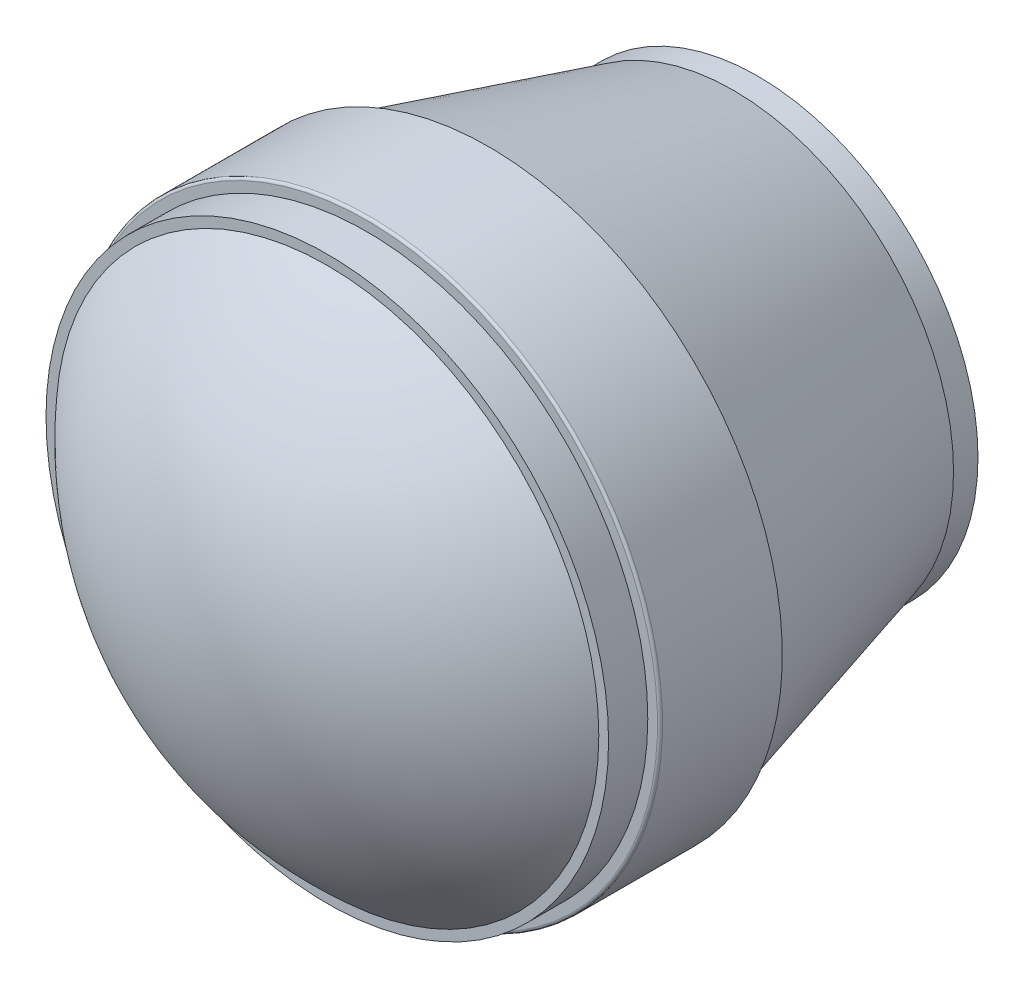
ISO-10303-21;
HEADER;
FILE_DESCRIPTION(('STEP AP214'),'2;1');
FILE_NAME('part.step','',(''),(''),'','','');
FILE_SCHEMA(('AUTOMOTIVE_DESIGN { 1 0 10303 214 1 1 1 1 }'));
ENDSEC;
DATA;
#1=APPLICATION_CONTEXT('core data for automotive mechanical design processes');
#2=APPLICATION_PROTOCOL_DEFINITION('international standard','automotive_design',2000,#1);
#3=PRODUCT_CONTEXT('',#1,'mechanical');
#4=PRODUCT('Part','Part','',(#3));
#5=PRODUCT_RELATED_PRODUCT_CATEGORY('part','',(#4));
#6=PRODUCT_DEFINITION_FORMATION('','',#4);
#7=PRODUCT_DEFINITION_CONTEXT('part definition',#1,'design');
#8=PRODUCT_DEFINITION('design','',#6,#7);
#9=PRODUCT_DEFINITION_SHAPE('','',#8);
#10=(LENGTH_UNIT() NAMED_UNIT(*) SI_UNIT(.MILLI.,.METRE.));
#11=(NAMED_UNIT(*) PLANE_ANGLE_UNIT() SI_UNIT($,.RADIAN.));
#12=(NAMED_UNIT(*) SI_UNIT($,.STERADIAN.) SOLID_ANGLE_UNIT());
#13=UNCERTAINTY_MEASURE_WITH_UNIT(LENGTH_MEASURE(1.E-05),#10,'distance_accuracy_value','');
#14=(GEOMETRIC_REPRESENTATION_CONTEXT(3) GLOBAL_UNCERTAINTY_ASSIGNED_CONTEXT((#13)) GLOBAL_UNIT_ASSIGNED_CONTEXT((#10,
#11,#12)) REPRESENTATION_CONTEXT('',''));
#15=CARTESIAN_POINT('',(0.,0.,0.));
#16=DIRECTION('',(0.,0.,1.));
#17=DIRECTION('',(1.,0.,0.));
#18=AXIS2_PLACEMENT_3D('',#15,#16,#17);
#19=CARTESIAN_POINT('',(0.,5.74999999999992,-2.55599000000001));
#20=DIRECTION('',(0.,0.,1.));
#21=DIRECTION('',(1.,0.,0.));
#22=AXIS2_PLACEMENT_3D('',#19,#20,#21);
#23=PLANE('',#22);
#24=CARTESIAN_POINT('',(0.,0.,-2.55599));
#25=DIRECTION('',(0.,0.,-1.));
#26=DIRECTION('',(-1.,0.,0.));
#27=AXIS2_PLACEMENT_3D('',#24,#25,#26);
#28=CIRCLE('',#27,5.55);
#29=CARTESIAN_POINT('',(-5.55,0.,-2.55599));
#30=VERTEX_POINT('',#29);
#31=EDGE_CURVE('E11',#30,#30,#28,.T.);
#32=ORIENTED_EDGE('',*,*,#31,.T.);
#33=EDGE_LOOP('',(#32));
#34=FACE_BOUND('',#33,.T.);
#35=CARTESIAN_POINT('',(0.,0.,-2.55599000000001));
#36=DIRECTION('',(0.,0.,-1.));
#37=DIRECTION('',(-1.,0.,0.));
#38=AXIS2_PLACEMENT_3D('',#35,#36,#37);
#39=CIRCLE('',#38,5.74999999999992);
#40=CARTESIAN_POINT('',(-5.74999999999992,0.,-2.55599000000001));
#41=VERTEX_POINT('',#40);
#42=EDGE_CURVE('E56',#41,#41,#39,.T.);
#43=ORIENTED_EDGE('',*,*,#42,.F.);
#44=EDGE_LOOP('',(#43));
#45=FACE_BOUND('',#44,.T.);
#46=ADVANCED_FACE('F33',(#34,#45),#23,.T.);
#47=CARTESIAN_POINT('',(0.,5.55,-2.55599));
#48=CARTESIAN_POINT('',(0.,5.53337209873222,-2.53735173688099));
#49=CARTESIAN_POINT('',(0.,5.50029565879505,-2.50027625870364));
#50=CARTESIAN_POINT('',(0.,5.45025529028149,-2.44557422195682));
#51=CARTESIAN_POINT('',(0.,5.40025355170964,-2.39188828408443));
#52=CARTESIAN_POINT('',(0.,5.35024431494861,-2.33922247648363));
#53=CARTESIAN_POINT('',(0.,5.30023794531119,-2.28753430946193));
#54=CARTESIAN_POINT('',(0.,5.25022693501801,-2.23679762278214));
#55=CARTESIAN_POINT('',(0.,5.20022271080883,-2.18697113251593));
#56=CARTESIAN_POINT('',(0.,5.15021714325753,-2.13803611959193));
#57=CARTESIAN_POINT('',(0.,5.10021313350646,-2.08996958834562));
#58=CARTESIAN_POINT('',(0.,5.05020060570106,-2.04275570458207));
#59=CARTESIAN_POINT('',(0.,5.00020348566313,-1.99634878068205));
#60=CARTESIAN_POINT('',(0.,4.95018963773111,-1.95075691034446));
#61=CARTESIAN_POINT('',(0.,4.90019543201219,-1.9059300729321));
#62=CARTESIAN_POINT('',(0.,4.85018226152232,-1.8618879509491));
#63=CARTESIAN_POINT('',(0.,4.80018048685117,-1.81858316974084));
#64=CARTESIAN_POINT('',(0.,4.75017819249483,-1.77600889165065));
#65=CARTESIAN_POINT('',(0.,4.70016822637256,-1.73415734805533));
#66=CARTESIAN_POINT('',(0.,4.65017276999354,-1.69299166299066));
#67=CARTESIAN_POINT('',(0.,4.60016287681557,-1.65253033936595));
#68=CARTESIAN_POINT('',(0.,4.55016021619984,-1.61273701163027));
#69=CARTESIAN_POINT('',(0.,4.50016074316774,-1.57360283969033));
#70=CARTESIAN_POINT('',(0.,4.45015101357654,-1.53513208969283));
#71=CARTESIAN_POINT('',(0.,4.40015156006923,-1.49728807361742));
#72=CARTESIAN_POINT('',(0.,4.3501484952175,-1.46007542440131));
#73=CARTESIAN_POINT('',(0.,4.30014159871163,-1.42348492188475));
#74=CARTESIAN_POINT('',(0.,4.25014553038416,-1.38748941681926));
#75=CARTESIAN_POINT('',(0.,4.20013530928753,-1.35211051187533));
#76=CARTESIAN_POINT('',(0.,4.15013616148217,-1.31730606211018));
#77=CARTESIAN_POINT('',(0.,4.10013192364611,-1.28308562310286));
#78=CARTESIAN_POINT('',(0.,4.05013226227716,-1.24943178836902));
#79=CARTESIAN_POINT('',(0.,4.00012549803757,-1.21635204346586));
#80=CARTESIAN_POINT('',(0.,3.95012562774226,-1.18381860117789));
#81=CARTESIAN_POINT('',(0.,3.90012209416492,-1.15183746681853));
#82=CARTESIAN_POINT('',(0.,3.85011873628313,-1.12039623507116));
#83=CARTESIAN_POINT('',(0.,3.80011831281486,-1.08948363175873));
#84=CARTESIAN_POINT('',(0.,3.75011493287817,-1.05910252566781));
#85=CARTESIAN_POINT('',(0.,3.70011152013921,-1.02924165902474));
#86=CARTESIAN_POINT('',(0.,3.65011120991024,-0.999888878349856));
#87=CARTESIAN_POINT('',(0.,3.60010729915597,-0.971049019153337));
#88=CARTESIAN_POINT('',(0.,3.55010740340088,-0.942705478038));
#89=CARTESIAN_POINT('',(0.,3.50010081620473,-0.914867347108363));
#90=CARTESIAN_POINT('',(0.,3.4501028176617,-0.887503780213954));
#91=CARTESIAN_POINT('',(0.,3.40010247317385,-0.860630847556723));
#92=CARTESIAN_POINT('',(0.,3.35009307065389,-0.834255388783046));
#93=CARTESIAN_POINT('',(0.,3.30009882306098,-0.808327594554558));
#94=CARTESIAN_POINT('',(0.,3.25009141180571,-0.782892021490438));
#95=CARTESIAN_POINT('',(0.,3.20009433024682,-0.757906070675454));
#96=CARTESIAN_POINT('',(0.,3.15008782526396,-0.733399151040507));
#97=CARTESIAN_POINT('',(0.,3.10008757688636,-0.709336299681244));
#98=CARTESIAN_POINT('',(0.,3.05008623144295,-0.685725631726773));
#99=CARTESIAN_POINT('',(0.,3.00008555140802,-0.662563479800299));
#100=CARTESIAN_POINT('',(0.,2.95008191814808,-0.639854553150656));
#101=CARTESIAN_POINT('',(0.,2.90008186318338,-0.617581010373986));
#102=CARTESIAN_POINT('',(0.,2.85007556007848,-0.595755257175779));
#103=CARTESIAN_POINT('',(0.,2.80007974382475,-0.574338539051278));
#104=CARTESIAN_POINT('',(0.,2.75007606146739,-0.553370049207278));
#105=CARTESIAN_POINT('',(0.,2.70007283949869,-0.532830883961523));
#106=CARTESIAN_POINT('',(0.,2.65007452454796,-0.512706127750875));
#107=CARTESIAN_POINT('',(0.,2.60006893912735,-0.493019727229111));
#108=CARTESIAN_POINT('',(0.,2.55006816426873,-0.473738026151257));
#109=CARTESIAN_POINT('',(0.,2.50006909387013,-0.454864866137183));
#110=CARTESIAN_POINT('',(0.,2.45006600953489,-0.436415736657631));
#111=CARTESIAN_POINT('',(0.,2.40006301139669,-0.41837673686093));
#112=CARTESIAN_POINT('',(0.,2.35006385167777,-0.400733589804309));
#113=CARTESIAN_POINT('',(0.,2.30006290298263,-0.383501889210399));
#114=CARTESIAN_POINT('',(0.,2.25005786218933,-0.366685967450592));
#115=CARTESIAN_POINT('',(0.,2.20005896327397,-0.350251722461569));
#116=CARTESIAN_POINT('',(0.,2.15005765107163,-0.334221213444992));
#117=CARTESIAN_POINT('',(0.,2.10005480597112,-0.31859245406645));
#118=CARTESIAN_POINT('',(0.,2.05005384358307,-0.303351068108334));
#119=CARTESIAN_POINT('',(0.,2.00005263446186,-0.2885004177811));
#120=CARTESIAN_POINT('',(0.,1.95005140756769,-0.274039825172292));
#121=CARTESIAN_POINT('',(0.,1.90005040207436,-0.259968353674334));
#122=CARTESIAN_POINT('',(0.,1.85004761165406,-0.24629018856555));
#123=CARTESIAN_POINT('',(0.,1.80004671795553,-0.232988482495236));
#124=CARTESIAN_POINT('',(0.,1.75004518938251,-0.220069217734872));
#125=CARTESIAN_POINT('',(0.,1.70004585408493,-0.207524249492567));
#126=CARTESIAN_POINT('',(0.,1.65004136956537,-0.195380444003122));
#127=CARTESIAN_POINT('',(0.,1.60004219474366,-0.183594648144193));
#128=CARTESIAN_POINT('',(0.,1.55003915516735,-0.172198760374988));
#129=CARTESIAN_POINT('',(0.,1.50003964905913,-0.16116380387552));
#130=CARTESIAN_POINT('',(0.,1.45003691807038,-0.150516909285306));
#131=CARTESIAN_POINT('',(0.,1.40003594890531,-0.140235292259403));
#132=CARTESIAN_POINT('',(0.,1.35003461154783,-0.130325403581292));
#133=CARTESIAN_POINT('',(0.,1.3000336243573,-0.120783561387308));
#134=CARTESIAN_POINT('',(0.,1.25003097483418,-0.11161778830183));
#135=CARTESIAN_POINT('',(0.,1.20003228042549,-0.10279942298774));
#136=CARTESIAN_POINT('',(0.,1.15002852914677,-0.0943770454475842));
#137=CARTESIAN_POINT('',(0.,1.10002871721485,-0.0863012921679459));
#138=CARTESIAN_POINT('',(0.,1.05002637043635,-0.078604567837689));
#139=CARTESIAN_POINT('',(0.,1.00002516149817,-0.0712644058360417));
#140=CARTESIAN_POINT('',(0.,0.950024959976278,-0.0642795830984429));
#141=CARTESIAN_POINT('',(0.,0.900021808960839,-0.0576772161764982));
#142=CARTESIAN_POINT('',(0.,0.85002242180179,-0.0514088834455987));
#143=CARTESIAN_POINT('',(0.,0.800020170636421,-0.0455232570706574));
#144=CARTESIAN_POINT('',(0.,0.750019052117986,-0.0399920413982639));
#145=CARTESIAN_POINT('',(0.,0.700017869521416,-0.0348208103251549));
#146=CARTESIAN_POINT('',(0.,0.650015893868685,-0.0300153416665003));
#147=CARTESIAN_POINT('',(0.,0.600015941633713,-0.0255468590090427));
#148=CARTESIAN_POINT('',(0.,0.550013421594739,-0.0214651870158862));
#149=CARTESIAN_POINT('',(0.,0.500012897725842,-0.0177188593732557));
#150=CARTESIAN_POINT('',(0.,0.450011021321258,-0.0143447952782268));
#151=CARTESIAN_POINT('',(0.,0.400010647417128,-0.0113063012634814));
#152=CARTESIAN_POINT('',(0.,0.350008586223088,-0.00865354575459947));
#153=CARTESIAN_POINT('',(0.,0.300007464330112,-0.00634212654909734));
#154=CARTESIAN_POINT('',(0.,0.250006415496167,-0.00437987041466554));
#155=CARTESIAN_POINT('',(0.,0.200005117887281,-0.0027797598194534));
#156=CARTESIAN_POINT('',(0.,0.150003700445851,-0.00154196477712719));
#157=CARTESIAN_POINT('',(0.,0.100002576524255,-0.000652865458244274));
#158=CARTESIAN_POINT('',(0.,0.0500012313084685,-0.000106797749939578));
#159=CARTESIAN_POINT('',(0.,0.0166668009999256,-3.55986602510183E-05));
#160=CARTESIAN_POINT('',(0.,0.,0.));
#161=B_SPLINE_CURVE_WITH_KNOTS('',3,(#47,#48,#49,#50,#51,#52,#53,#54,#55,#56,#57,#58,#59,#60,
#61,#62,#63,#64,#65,#66,#67,#68,#69,#70,#71,#72,#73,#74,#75,#76,#77,#78,#79,#80,#81,#82,#83,#84,
#85,#86,#87,#88,#89,#90,#91,#92,#93,#94,#95,#96,#97,#98,#99,#100,#101,#102,#103,#104,#105,#106,
#107,#108,#109,#110,#111,#112,#113,#114,#115,#116,#117,#118,#119,#120,#121,#122,#123,#124,#125,
#126,#127,#128,#129,#130,#131,#132,#133,#134,#135,#136,#137,#138,#139,#140,#141,#142,#143,#144,
#145,#146,#147,#148,#149,#150,#151,#152,#153,#154,#155,#156,#157,#158,#159,#160),.UNSPECIFIED.,
.F.,.F.,(4,1,1,1,1,1,1,1,1,1,1,1,1,1,1,1,1,1,1,1,1,1,1,1,1,1,1,1,1,1,1,1,1,1,1,1,1,1,1,1,1,1,1,
1,1,1,1,1,1,1,1,1,1,1,1,1,1,1,1,1,1,1,1,1,1,1,1,1,1,1,1,1,1,1,1,1,1,1,1,1,1,1,1,1,1,1,1,1,1,1,1,
1,1,1,1,1,1,1,1,1,1,1,1,1,1,1,1,1,1,1,1,4),(0.,0.0119034313381834,0.0236784622041519,
0.0353308998084116,0.0468664608669105,0.0582896280809051,0.0696048210247675,0.0808175157205074,
0.0919308693775356,0.102948002293811,0.113871996632441,0.124708056178319,0.13545700193096,
0.14612391533624,0.156708524102244,0.167215803780228,0.177647535698153,0.188005486805339,
0.198293428039022,0.208511056172901,0.218662069430077,0.228748130057139,0.238769913982337,
0.248730985437182,0.258631983771911,0.268474498105717,0.278261026038478,0.287991261387327,
0.297668568886449,0.30729353950591,0.31686766076849,0.326391522094731,0.335867454540267,
0.345296024123966,0.354678650953547,0.364016732317768,0.37331081744006,0.382562277783171,
0.391772461107823,0.400941897449314,0.410071907160666,0.41916301323378,0.428217270103609,
0.4372344198599,0.446214983880037,0.455161682283253,0.464073544287801,0.472952507646429,
0.481798354296219,0.490612969506157,0.499396824016593,0.508150393530529,0.516874158705251,
0.52556925135763,0.534236140353301,0.542876549277504,0.551489684206268,0.560076631026952,
0.568638447569002,0.57717499910434,0.585687901396985,0.594177588256806,0.602643946993632,
0.611087979391498,0.619510658348287,0.627911892493518,0.636292133165592,0.644652826391678,
0.652993901402272,0.661315797149784,0.669619418649171,0.677905188851383,0.686173533446818,
0.694424880822856,0.70265966201955,0.710878718900003,0.719082465525109,0.727271318278205,
0.735445320566023,0.743605643780954,0.751752335735941,0.759886163686682,0.768007201567109,
0.776116198381147,0.784213562885053,0.79229970559913,0.800375038755107,0.808440251750381,
0.816495209060515,0.824540856198506,0.8325773473937,0.840605333140886,0.84862521223276,
0.856637176320036,0.864642043266143,0.872639820972122,0.880631109959544,0.888616314539981,
0.896595839949869,0.904570233274651,0.912539619456305,0.920504665468759,0.928465649963069,
0.936423077818511,0.944377166678268,0.952328495641514,0.960277452660764,0.968224375069027,
0.976169673987047,0.984113788900934,0.992057091824273,1.),.UNSPECIFIED.);
#162=CARTESIAN_POINT('',(0.,0.,-11.886951367537));
#163=DIRECTION('',(0.,0.,-1.));
#164=AXIS1_PLACEMENT('',#162,#163);
#165=SURFACE_OF_REVOLUTION('',#161,#164);
#166=CARTESIAN_POINT('',(0.,0.,0.));
#167=VERTEX_POINT('',#166);
#168=VERTEX_LOOP('',#167);
#169=FACE_BOUND('',#168,.T.);
#170=ORIENTED_EDGE('',*,*,#31,.F.);
#171=EDGE_LOOP('',(#170));
#172=FACE_BOUND('',#171,.T.);
#173=ADVANCED_FACE('F46',(#169,#172),#165,.F.);
#174=CARTESIAN_POINT('',(0.,0.,-10.));
#175=CARTESIAN_POINT('',(0.,0.0166670799289271,-10.0000568612152));
#176=CARTESIAN_POINT('',(0.,0.0500036999109876,-10.0001705920385));
#177=CARTESIAN_POINT('',(0.,0.100007257753839,-10.0011179159715));
#178=CARTESIAN_POINT('',(0.,0.150010820582862,-10.0026188366253));
#179=CARTESIAN_POINT('',(0.,0.200014710354848,-10.0047291238337));
#180=CARTESIAN_POINT('',(0.,0.250018414263414,-10.0074489523997));
#181=CARTESIAN_POINT('',(0.,0.300021674103916,-10.0107817547681));
#182=CARTESIAN_POINT('',(0.,0.350025055012206,-10.014713510772));
#183=CARTESIAN_POINT('',(0.,0.400029972238761,-10.0192370732694));
#184=CARTESIAN_POINT('',(0.,0.450032140109073,-10.024395369498));
#185=CARTESIAN_POINT('',(0.,0.500036365756737,-10.030142727862));
#186=CARTESIAN_POINT('',(0.,0.550040909867812,-10.0365002003189));
#187=CARTESIAN_POINT('',(0.,0.600042391207639,-10.0434888451487));
#188=CARTESIAN_POINT('',(0.,0.650048046309427,-10.0510620884272));
#189=CARTESIAN_POINT('',(0.,0.700050298190132,-10.0592677785134));
#190=CARTESIAN_POINT('',(0.,0.750053759405735,-10.06807837655));
#191=CARTESIAN_POINT('',(0.,0.800058165035327,-10.0774977140125));
#192=CARTESIAN_POINT('',(0.,0.850061736787412,-10.0875385435592));
#193=CARTESIAN_POINT('',(0.,0.900063339626016,-10.0982044232644));
#194=CARTESIAN_POINT('',(0.,0.950069931372962,-10.1094682197269));
#195=CARTESIAN_POINT('',(0.,1.00006957278366,-10.1213783407921));
#196=CARTESIAN_POINT('',(0.,1.05007640068638,-10.1338821000729));
#197=CARTESIAN_POINT('',(0.,1.10007729946697,-10.1470293426346));
#198=CARTESIAN_POINT('',(0.,1.15008261679492,-10.1607865139906));
#199=CARTESIAN_POINT('',(0.,1.20008342968752,-10.1751829037506));
#200=CARTESIAN_POINT('',(0.,1.25008876641718,-10.1901904016688));
#201=CARTESIAN_POINT('',(0.,1.30008913738671,-10.2058372424361));
#202=CARTESIAN_POINT('',(0.,1.35009613192479,-10.2220933783347));
#203=CARTESIAN_POINT('',(0.,1.4000969623206,-10.2389984814956));
#204=CARTESIAN_POINT('',(0.,1.45009763310215,-10.256533002713));
#205=CARTESIAN_POINT('',(0.,1.50010438535272,-10.2746807104042));
#206=CARTESIAN_POINT('',(0.,1.55010680692758,-10.2934739299596));
#207=CARTESIAN_POINT('',(0.,1.60010747091505,-10.3129078735022));
#208=CARTESIAN_POINT('',(0.,1.65011002680999,-10.3329700020986));
#209=CARTESIAN_POINT('',(0.,1.70011408651012,-10.3536617742634));
#210=CARTESIAN_POINT('',(0.,1.75011939308442,-10.3749910669855));
#211=CARTESIAN_POINT('',(0.,1.80011574314799,-10.3969803923387));
#212=CARTESIAN_POINT('',(0.,1.85012682012252,-10.4195836016403));
#213=CARTESIAN_POINT('',(0.,1.90011980151022,-10.4428660461764));
#214=CARTESIAN_POINT('',(0.,1.95013089499847,-10.4667598595083));
#215=CARTESIAN_POINT('',(0.,2.00012846192749,-10.4913285628399));
#216=CARTESIAN_POINT('',(0.,2.0501370805288,-10.5165350337576));
#217=CARTESIAN_POINT('',(0.,2.10013210953944,-10.5424246045455));
#218=CARTESIAN_POINT('',(0.,2.1501430916724,-10.5689503716781));
#219=CARTESIAN_POINT('',(0.,2.20014063447961,-10.5961680841274));
#220=CARTESIAN_POINT('',(0.,2.25014807230445,-10.6240476466491));
#221=CARTESIAN_POINT('',(0.,2.30015186617097,-10.6526207917463));
#222=CARTESIAN_POINT('',(0.,2.35015314712866,-10.681894817645));
#223=CARTESIAN_POINT('',(0.,2.40015935876711,-10.7118672426471));
#224=CARTESIAN_POINT('',(0.,2.45016886339247,-10.7425582028082));
#225=CARTESIAN_POINT('',(0.,2.50016935174033,-10.7740038663788));
#226=CARTESIAN_POINT('',(0.,2.55017582443406,-10.8061967493075));
#227=CARTESIAN_POINT('',(0.,2.60018709844245,-10.839159562208));
#228=CARTESIAN_POINT('',(0.,2.6501964075626,-10.8729327850392));
#229=CARTESIAN_POINT('',(0.,2.70019838273086,-10.9075501750936));
#230=CARTESIAN_POINT('',(0.,2.7502164886515,-10.9430118727698));
#231=CARTESIAN_POINT('',(0.,2.80022637567797,-10.9793894340382));
#232=CARTESIAN_POINT('',(0.,2.8502409306298,-11.0167147638371));
#233=CARTESIAN_POINT('',(0.,2.90025357644463,-11.0550435349186));
#234=CARTESIAN_POINT('',(0.,2.95027614742417,-11.094420826046));
#235=CARTESIAN_POINT('',(0.,3.00029377570796,-11.1349325621807));
#236=CARTESIAN_POINT('',(0.,3.05032018026012,-11.1766450775451));
#237=CARTESIAN_POINT('',(0.,3.1003496898697,-11.2196567805482));
#238=CARTESIAN_POINT('',(0.,3.15036430094926,-11.2640890056807));
#239=CARTESIAN_POINT('',(0.,3.20045653557233,-11.3099696143892));
#240=CARTESIAN_POINT('',(0.,3.23339405035736,-11.3415554965348));
#241=CARTESIAN_POINT('',(0.,3.25,-11.35748));
#242=B_SPLINE_CURVE_WITH_KNOTS('',3,(#174,#175,#176,#177,#178,#179,#180,#181,#182,#183,#184,
#185,#186,#187,#188,#189,#190,#191,#192,#193,#194,#195,#196,#197,#198,#199,#200,#201,#202,#203,
#204,#205,#206,#207,#208,#209,#210,#211,#212,#213,#214,#215,#216,#217,#218,#219,#220,#221,#222,
#223,#224,#225,#226,#227,#228,#229,#230,#231,#232,#233,#234,#235,#236,#237,#238,#239,#240,#241),
.UNSPECIFIED.,.F.,.F.,(4,1,1,1,1,1,1,1,1,1,1,1,1,1,1,1,1,1,1,1,1,1,1,1,1,1,1,1,1,1,1,1,1,1,1,1,
1,1,1,1,1,1,1,1,1,1,1,1,1,1,1,1,1,1,1,1,1,1,1,1,1,1,1,1,1,4),(0.,0.0138713159570835,
0.0277446793730083,0.0416220696951747,0.0555054815562182,0.0693970574131134,0.0832988526293177,
0.0972127003819558,0.111140579667765,0.125085030897255,0.139047518334765,0.1530303501583,
0.16703592504869,0.181065482176881,0.195121848863449,0.209206592949767,0.223321686399255,
0.237469634383028,0.251652446870542,0.265871508785331,0.280130020362169,0.294428661314247,
0.308770725673336,0.323157469300298,0.337591570771258,0.352074186536344,0.366608018397467,
0.38119412256239,0.395836108958378,0.410534991688195,0.425291674553185,0.440109879842305,
0.454991471644208,0.469937257130208,0.484948996734066,0.500029516139097,0.515181700071829,
0.530405060015487,0.545704771673783,0.561079045050652,0.576533164974509,0.592067629913805,
0.607686658486661,0.623389393907492,0.639181428579596,0.655063149879275,0.671038969197121,
0.687112016957184,0.703284040610956,0.719559657516372,0.735945076950366,0.752442192374578,
0.769055912133371,0.785794359264669,0.802664340950369,0.819669638229983,0.83682221291941,
0.854131130366886,0.871607402099003,0.889262380394307,0.907112993019946,0.925174996263649,
0.94347008610135,0.962020758728356,0.980852187175044,1.),.UNSPECIFIED.);
#243=CARTESIAN_POINT('',(0.,0.,-11.886951367537));
#244=DIRECTION('',(0.,0.,-1.));
#245=AXIS1_PLACEMENT('',#243,#244);
#246=SURFACE_OF_REVOLUTION('',#242,#245);
#247=CARTESIAN_POINT('',(0.,0.,-11.35748));
#248=DIRECTION('',(0.,0.,-1.));
#249=DIRECTION('',(-1.,0.,0.));
#250=AXIS2_PLACEMENT_3D('',#247,#248,#249);
#251=CIRCLE('',#250,3.25);
#252=CARTESIAN_POINT('',(-3.25,0.,-11.35748));
#253=VERTEX_POINT('',#252);
#254=EDGE_CURVE('E40',#253,#253,#251,.T.);
#255=ORIENTED_EDGE('',*,*,#254,.T.);
#256=EDGE_LOOP('',(#255));
#257=FACE_BOUND('',#256,.T.);
#258=CARTESIAN_POINT('',(0.,0.,-10.));
#259=VERTEX_POINT('',#258);
#260=VERTEX_LOOP('',#259);
#261=FACE_BOUND('',#260,.T.);
#262=ADVANCED_FACE('F49',(#257,#261),#246,.F.);
#263=CARTESIAN_POINT('',(0.,3.25,-11.35748));
#264=DIRECTION('',(0.,0.,-1.));
#265=DIRECTION('',(-1.,0.,0.));
#266=AXIS2_PLACEMENT_3D('',#263,#264,#265);
#267=PLANE('',#266);
#268=CARTESIAN_POINT('',(0.,0.,-11.35748));
#269=DIRECTION('',(0.,0.,-1.));
#270=DIRECTION('',(-1.,0.,0.));
#271=AXIS2_PLACEMENT_3D('',#268,#269,#270);
#272=CIRCLE('',#271,4.5);
#273=CARTESIAN_POINT('',(-4.5,0.,-11.35748));
#274=VERTEX_POINT('',#273);
#275=EDGE_CURVE('E83',#274,#274,#272,.T.);
#276=ORIENTED_EDGE('',*,*,#275,.T.);
#277=EDGE_LOOP('',(#276));
#278=FACE_BOUND('',#277,.T.);
#279=ORIENTED_EDGE('',*,*,#254,.F.);
#280=EDGE_LOOP('',(#279));
#281=FACE_BOUND('',#280,.T.);
#282=ADVANCED_FACE('F89',(#278,#281),#267,.T.);
#283=CARTESIAN_POINT('',(0.,0.,-11.886951367537));
#284=DIRECTION('',(0.,0.,-1.));
#285=DIRECTION('',(-1.,0.,0.));
#286=AXIS2_PLACEMENT_3D('',#283,#284,#285);
#287=CYLINDRICAL_SURFACE('',#286,4.5);
#288=CARTESIAN_POINT('',(0.,0.,-10.85748));
#289=DIRECTION('',(0.,0.,-1.));
#290=DIRECTION('',(-1.,0.,0.));
#291=AXIS2_PLACEMENT_3D('',#288,#289,#290);
#292=CIRCLE('',#291,4.5);
#293=CARTESIAN_POINT('',(-4.5,0.,-10.85748));
#294=VERTEX_POINT('',#293);
#295=EDGE_CURVE('E80',#294,#294,#292,.T.);
#296=ORIENTED_EDGE('',*,*,#295,.T.);
#297=EDGE_LOOP('',(#296));
#298=FACE_BOUND('',#297,.T.);
#299=ORIENTED_EDGE('',*,*,#275,.F.);
#300=EDGE_LOOP('',(#299));
#301=FACE_BOUND('',#300,.T.);
#302=ADVANCED_FACE('F91',(#298,#301),#287,.T.);
#303=CARTESIAN_POINT('',(0.,0.,-10.85748));
#304=DIRECTION('',(0.,0.,1.));
#305=DIRECTION('',(1.,0.,0.));
#306=AXIS2_PLACEMENT_3D('',#303,#304,#305);
#307=CONICAL_SURFACE('',#306,4.5,0.267994296072919);
#308=CARTESIAN_POINT('',(0.,0.,-5.85748));
#309=DIRECTION('',(0.,0.,-1.));
#310=DIRECTION('',(-1.,0.,0.));
#311=AXIS2_PLACEMENT_3D('',#308,#309,#310);
#312=CIRCLE('',#311,5.87299999999978);
#313=CARTESIAN_POINT('',(-5.87299999999978,0.,-5.85748));
#314=VERTEX_POINT('',#313);
#315=EDGE_CURVE('E77',#314,#314,#312,.T.);
#316=ORIENTED_EDGE('',*,*,#315,.T.);
#317=EDGE_LOOP('',(#316));
#318=FACE_BOUND('',#317,.T.);
#319=ORIENTED_EDGE('',*,*,#295,.F.);
#320=EDGE_LOOP('',(#319));
#321=FACE_BOUND('',#320,.T.);
#322=ADVANCED_FACE('F98',(#318,#321),#307,.T.);
#323=CARTESIAN_POINT('',(0.,5.99999999999978,-5.85748));
#324=DIRECTION('',(0.,0.,-1.));
#325=DIRECTION('',(-1.,0.,0.));
#326=AXIS2_PLACEMENT_3D('',#323,#324,#325);
#327=PLANE('',#326);
#328=CARTESIAN_POINT('',(0.,0.,-5.85748));
#329=DIRECTION('',(0.,0.,-1.));
#330=DIRECTION('',(-1.,0.,0.));
#331=AXIS2_PLACEMENT_3D('',#328,#329,#330);
#332=CIRCLE('',#331,5.99999999999978);
#333=CARTESIAN_POINT('',(-5.99999999999978,0.,-5.85748));
#334=VERTEX_POINT('',#333);
#335=EDGE_CURVE('E74',#334,#334,#332,.T.);
#336=ORIENTED_EDGE('',*,*,#335,.T.);
#337=EDGE_LOOP('',(#336));
#338=FACE_BOUND('',#337,.T.);
#339=ORIENTED_EDGE('',*,*,#315,.F.);
#340=EDGE_LOOP('',(#339));
#341=FACE_BOUND('',#340,.T.);
#342=ADVANCED_FACE('F111',(#338,#341),#327,.T.);
#343=CARTESIAN_POINT('',(0.,0.,-11.886951367537));
#344=DIRECTION('',(0.,0.,-1.));
#345=DIRECTION('',(-1.,0.,0.));
#346=AXIS2_PLACEMENT_3D('',#343,#344,#345);
#347=CYLINDRICAL_SURFACE('',#346,5.99999999999978);
#348=CARTESIAN_POINT('',(0.,0.,-3.40828));
#349=DIRECTION('',(0.,0.,-1.));
#350=DIRECTION('',(-1.,0.,0.));
#351=AXIS2_PLACEMENT_3D('',#348,#349,#350);
#352=CIRCLE('',#351,5.99999999999978);
#353=CARTESIAN_POINT('',(-5.99999999999978,0.,-3.40828));
#354=VERTEX_POINT('',#353);
#355=EDGE_CURVE('E71',#354,#354,#352,.T.);
#356=ORIENTED_EDGE('',*,*,#355,.T.);
#357=EDGE_LOOP('',(#356));
#358=FACE_BOUND('',#357,.T.);
#359=ORIENTED_EDGE('',*,*,#335,.F.);
#360=EDGE_LOOP('',(#359));
#361=FACE_BOUND('',#360,.T.);
#362=ADVANCED_FACE('F115',(#358,#361),#347,.T.);
#363=CARTESIAN_POINT('',(0.,0.,-3.40828));
#364=DIRECTION('',(0.,0.,-1.));
#365=DIRECTION('',(-1.,0.,0.));
#366=AXIS2_PLACEMENT_3D('',#363,#364,#365);
#367=TOROIDAL_SURFACE('',#366,5.94919999999978,0.0508000000000002);
#368=CARTESIAN_POINT('',(0.,0.,-3.35748));
#369=DIRECTION('',(0.,0.,-1.));
#370=DIRECTION('',(-1.,0.,0.));
#371=AXIS2_PLACEMENT_3D('',#368,#369,#370);
#372=CIRCLE('',#371,5.94919999999978);
#373=CARTESIAN_POINT('',(-5.94919999999978,0.,-3.35748));
#374=VERTEX_POINT('',#373);
#375=EDGE_CURVE('E61',#374,#374,#372,.T.);
#376=ORIENTED_EDGE('',*,*,#375,.T.);
#377=EDGE_LOOP('',(#376));
#378=FACE_BOUND('',#377,.T.);
#379=ORIENTED_EDGE('',*,*,#355,.F.);
#380=EDGE_LOOP('',(#379));
#381=FACE_BOUND('',#380,.T.);
#382=ADVANCED_FACE('F119',(#378,#381),#367,.T.);
#383=CARTESIAN_POINT('',(0.,5.74999999999992,-3.35748));
#384=DIRECTION('',(0.,0.,1.));
#385=DIRECTION('',(1.,0.,0.));
#386=AXIS2_PLACEMENT_3D('',#383,#384,#385);
#387=PLANE('',#386);
#388=CARTESIAN_POINT('',(0.,0.,-3.35748));
#389=DIRECTION('',(0.,0.,-1.));
#390=DIRECTION('',(-1.,0.,0.));
#391=AXIS2_PLACEMENT_3D('',#388,#389,#390);
#392=CIRCLE('',#391,5.74999999999992);
#393=CARTESIAN_POINT('',(-5.74999999999992,0.,-3.35748));
#394=VERTEX_POINT('',#393);
#395=EDGE_CURVE('E58',#394,#394,#392,.T.);
#396=ORIENTED_EDGE('',*,*,#395,.T.);
#397=EDGE_LOOP('',(#396));
#398=FACE_BOUND('',#397,.T.);
#399=ORIENTED_EDGE('',*,*,#375,.F.);
#400=EDGE_LOOP('',(#399));
#401=FACE_BOUND('',#400,.T.);
#402=ADVANCED_FACE('F123',(#398,#401),#387,.T.);
#403=CARTESIAN_POINT('',(0.,0.,-11.886951367537));
#404=DIRECTION('',(0.,0.,-1.));
#405=DIRECTION('',(-1.,0.,0.));
#406=AXIS2_PLACEMENT_3D('',#403,#404,#405);
#407=CYLINDRICAL_SURFACE('',#406,5.74999999999992);
#408=ORIENTED_EDGE('',*,*,#42,.T.);
#409=EDGE_LOOP('',(#408));
#410=FACE_BOUND('',#409,.T.);
#411=ORIENTED_EDGE('',*,*,#395,.F.);
#412=EDGE_LOOP('',(#411));
#413=FACE_BOUND('',#412,.T.);
#414=ADVANCED_FACE('F127',(#410,#413),#407,.T.);
#415=CLOSED_SHELL('',(#46,#173,#262,#282,#302,#322,#342,#362,#382,#402,#414));
#416=MANIFOLD_SOLID_BREP('B2',#415);
#417=ADVANCED_BREP_SHAPE_REPRESENTATION('',(#18,#416),#14);
#418=SHAPE_DEFINITION_REPRESENTATION(#9,#417);
ENDSEC;
END-ISO-10303-21;
